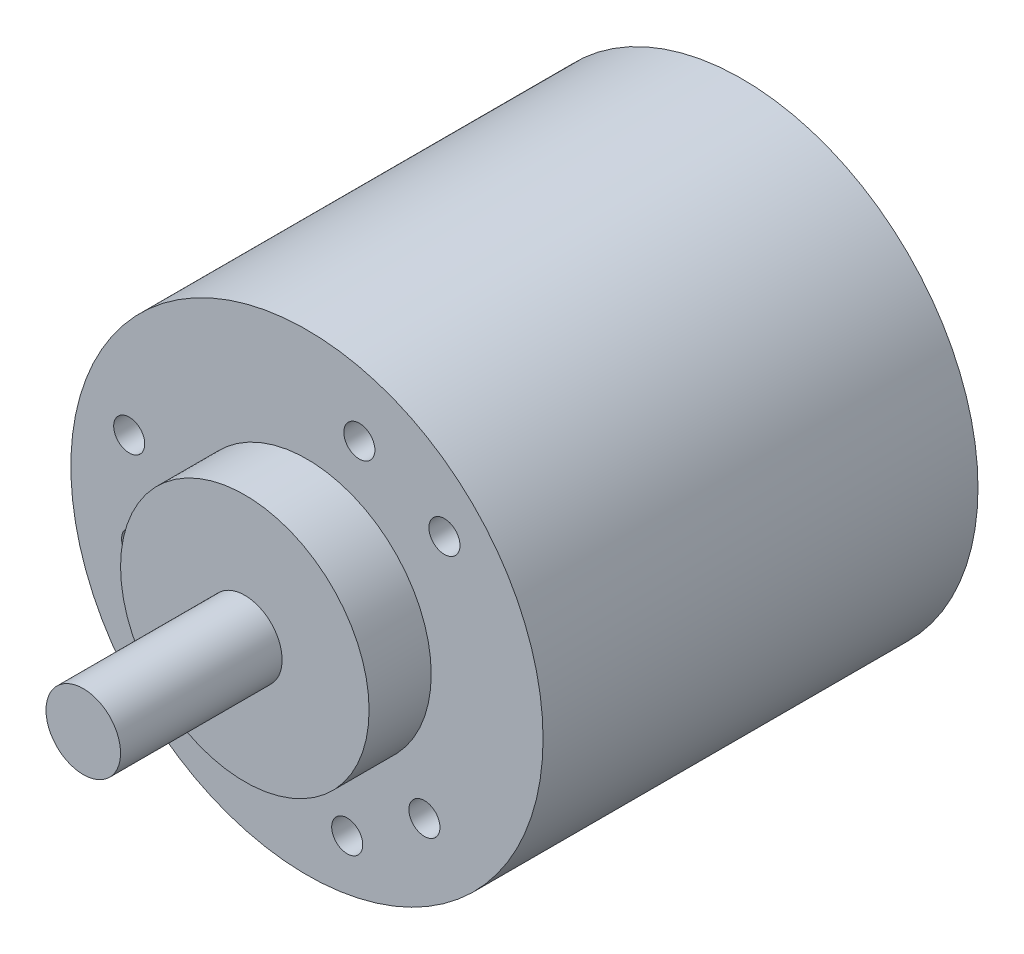
ISO-10303-21;
HEADER;
FILE_DESCRIPTION(('STEP AP214'),'2;1');
FILE_NAME('part.step','',(''),(''),'','','');
FILE_SCHEMA(('AUTOMOTIVE_DESIGN { 1 0 10303 214 1 1 1 1 }'));
ENDSEC;
DATA;
#1=APPLICATION_CONTEXT('core data for automotive mechanical design processes');
#2=APPLICATION_PROTOCOL_DEFINITION('international standard','automotive_design',2000,#1);
#3=PRODUCT_CONTEXT('',#1,'mechanical');
#4=PRODUCT('Part','Part','',(#3));
#5=PRODUCT_RELATED_PRODUCT_CATEGORY('part','',(#4));
#6=PRODUCT_DEFINITION_FORMATION('','',#4);
#7=PRODUCT_DEFINITION_CONTEXT('part definition',#1,'design');
#8=PRODUCT_DEFINITION('design','',#6,#7);
#9=PRODUCT_DEFINITION_SHAPE('','',#8);
#10=(LENGTH_UNIT() NAMED_UNIT(*) SI_UNIT(.MILLI.,.METRE.));
#11=(NAMED_UNIT(*) PLANE_ANGLE_UNIT() SI_UNIT($,.RADIAN.));
#12=(NAMED_UNIT(*) SI_UNIT($,.STERADIAN.) SOLID_ANGLE_UNIT());
#13=UNCERTAINTY_MEASURE_WITH_UNIT(LENGTH_MEASURE(1.E-05),#10,'distance_accuracy_value','');
#14=(GEOMETRIC_REPRESENTATION_CONTEXT(3) GLOBAL_UNCERTAINTY_ASSIGNED_CONTEXT((#13)) GLOBAL_UNIT_ASSIGNED_CONTEXT((#10,
#11,#12)) REPRESENTATION_CONTEXT('',''));
#15=CARTESIAN_POINT('',(0.,0.,0.));
#16=DIRECTION('',(0.,0.,1.));
#17=DIRECTION('',(1.,0.,0.));
#18=AXIS2_PLACEMENT_3D('',#15,#16,#17);
#19=CARTESIAN_POINT('',(0.,0.,35.));
#20=DIRECTION('',(0.,0.,-1.));
#21=DIRECTION('',(-1.,0.,0.));
#22=AXIS2_PLACEMENT_3D('',#19,#20,#21);
#23=CYLINDRICAL_SURFACE('',#22,19.);
#24=CARTESIAN_POINT('',(0.,0.,35.));
#25=DIRECTION('',(0.,0.,1.));
#26=DIRECTION('',(1.,0.,0.));
#27=AXIS2_PLACEMENT_3D('',#24,#25,#26);
#28=CIRCLE('',#27,19.);
#29=CARTESIAN_POINT('',(19.,0.,35.));
#30=VERTEX_POINT('',#29);
#31=EDGE_CURVE('E10',#30,#30,#28,.T.);
#32=ORIENTED_EDGE('',*,*,#31,.F.);
#33=EDGE_LOOP('',(#32));
#34=FACE_BOUND('',#33,.T.);
#35=CARTESIAN_POINT('',(0.,0.,0.));
#36=DIRECTION('',(0.,0.,1.));
#37=DIRECTION('',(1.,0.,0.));
#38=AXIS2_PLACEMENT_3D('',#35,#36,#37);
#39=CIRCLE('',#38,19.);
#40=CARTESIAN_POINT('',(19.,0.,0.));
#41=VERTEX_POINT('',#40);
#42=EDGE_CURVE('E34',#41,#41,#39,.T.);
#43=ORIENTED_EDGE('',*,*,#42,.T.);
#44=EDGE_LOOP('',(#43));
#45=FACE_BOUND('',#44,.T.);
#46=ADVANCED_FACE('F31',(#34,#45),#23,.T.);
#47=CARTESIAN_POINT('',(0.,0.,35.));
#48=DIRECTION('',(0.,0.,1.));
#49=DIRECTION('',(1.,0.,0.));
#50=AXIS2_PLACEMENT_3D('',#47,#48,#49);
#51=PLANE('',#50);
#52=CARTESIAN_POINT('',(4.21630395639813,13.3500105223652,35.));
#53=DIRECTION('',(0.,0.,1.));
#54=DIRECTION('',(1.,0.,0.));
#55=AXIS2_PLACEMENT_3D('',#52,#53,#54);
#56=CIRCLE('',#55,1.25);
#57=CARTESIAN_POINT('',(5.46630395639812,13.3500105223652,35.));
#58=VERTEX_POINT('',#57);
#59=EDGE_CURVE('E73',#58,#58,#56,.T.);
#60=ORIENTED_EDGE('',*,*,#59,.F.);
#61=EDGE_LOOP('',(#60));
#62=FACE_BOUND('',#61,.T.);
#63=CARTESIAN_POINT('',(11.0640338544645,10.1285317231701,35.));
#64=DIRECTION('',(0.,0.,1.));
#65=DIRECTION('',(1.,0.,0.));
#66=AXIS2_PLACEMENT_3D('',#63,#64,#65);
#67=CIRCLE('',#66,1.25);
#68=CARTESIAN_POINT('',(12.3140338544645,10.1285317231701,35.));
#69=VERTEX_POINT('',#68);
#70=EDGE_CURVE('E79',#69,#69,#67,.T.);
#71=ORIENTED_EDGE('',*,*,#70,.F.);
#72=EDGE_LOOP('',(#71));
#73=FACE_BOUND('',#72,.T.);
#74=CARTESIAN_POINT('',(9.45329627495879,-10.3264315975002,35.));
#75=DIRECTION('',(0.,0.,1.));
#76=DIRECTION('',(1.,0.,0.));
#77=AXIS2_PLACEMENT_3D('',#74,#75,#76);
#78=CIRCLE('',#77,1.25);
#79=CARTESIAN_POINT('',(10.7032962749588,-10.3264315975002,35.));
#80=VERTEX_POINT('',#79);
#81=EDGE_CURVE('E85',#80,#80,#78,.T.);
#82=ORIENTED_EDGE('',*,*,#81,.F.);
#83=EDGE_LOOP('',(#82));
#84=FACE_BOUND('',#83,.T.);
#85=CARTESIAN_POINT('',(3.23954884806965,-14.6460002478824,35.));
#86=DIRECTION('',(0.,0.,1.));
#87=DIRECTION('',(1.,0.,0.));
#88=AXIS2_PLACEMENT_3D('',#85,#86,#87);
#89=CIRCLE('',#88,1.25);
#90=CARTESIAN_POINT('',(4.48954884806965,-14.6460002478824,35.));
#91=VERTEX_POINT('',#90);
#92=EDGE_CURVE('E61',#91,#91,#89,.T.);
#93=ORIENTED_EDGE('',*,*,#92,.F.);
#94=EDGE_LOOP('',(#93));
#95=FACE_BOUND('',#94,.T.);
#96=CARTESIAN_POINT('',(-13.6696002313569,-3.02357892486496,35.));
#97=DIRECTION('',(0.,0.,1.));
#98=DIRECTION('',(1.,0.,0.));
#99=AXIS2_PLACEMENT_3D('',#96,#97,#98);
#100=CIRCLE('',#99,1.25);
#101=CARTESIAN_POINT('',(-12.4196002313569,-3.02357892486496,35.));
#102=VERTEX_POINT('',#101);
#103=EDGE_CURVE('E68',#102,#102,#100,.T.);
#104=ORIENTED_EDGE('',*,*,#103,.F.);
#105=EDGE_LOOP('',(#104));
#106=FACE_BOUND('',#105,.T.);
#107=CARTESIAN_POINT('',(-14.3035827025342,4.51746852471222,35.));
#108=DIRECTION('',(0.,0.,1.));
#109=DIRECTION('',(1.,0.,0.));
#110=AXIS2_PLACEMENT_3D('',#107,#108,#109);
#111=CIRCLE('',#110,1.25);
#112=CARTESIAN_POINT('',(-13.0535827025342,4.51746852471222,35.));
#113=VERTEX_POINT('',#112);
#114=EDGE_CURVE('E55',#113,#113,#111,.T.);
#115=ORIENTED_EDGE('',*,*,#114,.F.);
#116=EDGE_LOOP('',(#115));
#117=FACE_BOUND('',#116,.T.);
#118=CARTESIAN_POINT('',(0.,0.,35.));
#119=DIRECTION('',(0.,0.,1.));
#120=DIRECTION('',(1.,0.,0.));
#121=AXIS2_PLACEMENT_3D('',#118,#119,#120);
#122=CIRCLE('',#121,10.);
#123=CARTESIAN_POINT('',(10.,0.,35.));
#124=VERTEX_POINT('',#123);
#125=EDGE_CURVE('E43',#124,#124,#122,.T.);
#126=ORIENTED_EDGE('',*,*,#125,.F.);
#127=EDGE_LOOP('',(#126));
#128=FACE_BOUND('',#127,.T.);
#129=ORIENTED_EDGE('',*,*,#31,.T.);
#130=EDGE_LOOP('',(#129));
#131=FACE_BOUND('',#130,.T.);
#132=ADVANCED_FACE('F100',(#62,#73,#84,#95,#106,#117,#128,#131),#51,.T.);
#133=CARTESIAN_POINT('',(0.,0.,0.));
#134=DIRECTION('',(0.,0.,1.));
#135=DIRECTION('',(1.,0.,0.));
#136=AXIS2_PLACEMENT_3D('',#133,#134,#135);
#137=PLANE('',#136);
#138=ORIENTED_EDGE('',*,*,#42,.F.);
#139=EDGE_LOOP('',(#138));
#140=FACE_BOUND('',#139,.T.);
#141=ADVANCED_FACE('F103',(#140),#137,.F.);
#142=CARTESIAN_POINT('',(0.,0.,40.));
#143=DIRECTION('',(0.,0.,-1.));
#144=DIRECTION('',(-1.,0.,0.));
#145=AXIS2_PLACEMENT_3D('',#142,#143,#144);
#146=CYLINDRICAL_SURFACE('',#145,10.);
#147=CARTESIAN_POINT('',(0.,0.,40.));
#148=DIRECTION('',(0.,0.,1.));
#149=DIRECTION('',(1.,0.,0.));
#150=AXIS2_PLACEMENT_3D('',#147,#148,#149);
#151=CIRCLE('',#150,10.);
#152=CARTESIAN_POINT('',(10.,0.,40.));
#153=VERTEX_POINT('',#152);
#154=EDGE_CURVE('E41',#153,#153,#151,.T.);
#155=ORIENTED_EDGE('',*,*,#154,.F.);
#156=EDGE_LOOP('',(#155));
#157=FACE_BOUND('',#156,.T.);
#158=ORIENTED_EDGE('',*,*,#125,.T.);
#159=EDGE_LOOP('',(#158));
#160=FACE_BOUND('',#159,.T.);
#161=ADVANCED_FACE('F114',(#157,#160),#146,.T.);
#162=CARTESIAN_POINT('',(0.,0.,40.));
#163=DIRECTION('',(0.,0.,1.));
#164=DIRECTION('',(1.,0.,0.));
#165=AXIS2_PLACEMENT_3D('',#162,#163,#164);
#166=PLANE('',#165);
#167=CARTESIAN_POINT('',(0.,0.,40.));
#168=DIRECTION('',(0.,0.,1.));
#169=DIRECTION('',(1.,0.,0.));
#170=AXIS2_PLACEMENT_3D('',#167,#168,#169);
#171=CIRCLE('',#170,3.);
#172=CARTESIAN_POINT('',(-3.,0.,40.));
#173=VERTEX_POINT('',#172);
#174=EDGE_CURVE('E49',#173,#173,#171,.T.);
#175=ORIENTED_EDGE('',*,*,#174,.F.);
#176=EDGE_LOOP('',(#175));
#177=FACE_BOUND('',#176,.T.);
#178=ORIENTED_EDGE('',*,*,#154,.T.);
#179=EDGE_LOOP('',(#178));
#180=FACE_BOUND('',#179,.T.);
#181=ADVANCED_FACE('F116',(#177,#180),#166,.T.);
#182=CARTESIAN_POINT('',(0.,0.,53.));
#183=DIRECTION('',(0.,0.,-1.));
#184=DIRECTION('',(-1.,0.,0.));
#185=AXIS2_PLACEMENT_3D('',#182,#183,#184);
#186=CYLINDRICAL_SURFACE('',#185,3.);
#187=CARTESIAN_POINT('',(0.,0.,53.));
#188=DIRECTION('',(0.,0.,1.));
#189=DIRECTION('',(1.,0.,0.));
#190=AXIS2_PLACEMENT_3D('',#187,#188,#189);
#191=CIRCLE('',#190,3.);
#192=CARTESIAN_POINT('',(-3.,0.,53.));
#193=VERTEX_POINT('',#192);
#194=EDGE_CURVE('E46',#193,#193,#191,.T.);
#195=CARTESIAN_POINT('',(-3.,0.,53.));
#196=CARTESIAN_POINT('',(-3.,0.,52.8645833333333));
#197=CARTESIAN_POINT('',(-3.,0.,52.7291666666667));
#198=CARTESIAN_POINT('',(-3.,0.,52.4583333333333));
#199=CARTESIAN_POINT('',(-3.,0.,52.3229166666667));
#200=CARTESIAN_POINT('',(-3.,0.,52.0520833333333));
#201=CARTESIAN_POINT('',(-3.,0.,51.9166666666667));
#202=CARTESIAN_POINT('',(-3.,0.,51.6458333333333));
#203=CARTESIAN_POINT('',(-3.,0.,51.5104166666667));
#204=CARTESIAN_POINT('',(-3.,0.,51.2395833333333));
#205=CARTESIAN_POINT('',(-3.,0.,51.1041666666667));
#206=CARTESIAN_POINT('',(-3.,0.,50.8333333333333));
#207=CARTESIAN_POINT('',(-3.,0.,50.6979166666667));
#208=CARTESIAN_POINT('',(-3.,0.,50.4270833333333));
#209=CARTESIAN_POINT('',(-3.,0.,50.2916666666667));
#210=CARTESIAN_POINT('',(-3.,0.,50.0208333333333));
#211=CARTESIAN_POINT('',(-3.,0.,49.8854166666667));
#212=CARTESIAN_POINT('',(-3.,0.,49.6145833333333));
#213=CARTESIAN_POINT('',(-3.,0.,49.4791666666667));
#214=CARTESIAN_POINT('',(-3.,0.,49.2083333333333));
#215=CARTESIAN_POINT('',(-3.,0.,49.0729166666667));
#216=CARTESIAN_POINT('',(-3.,0.,48.8020833333333));
#217=CARTESIAN_POINT('',(-3.,0.,48.6666666666667));
#218=CARTESIAN_POINT('',(-3.,0.,48.3958333333333));
#219=CARTESIAN_POINT('',(-3.,0.,48.2604166666667));
#220=CARTESIAN_POINT('',(-3.,0.,47.9895833333333));
#221=CARTESIAN_POINT('',(-3.,0.,47.8541666666667));
#222=CARTESIAN_POINT('',(-3.,0.,47.5833333333333));
#223=CARTESIAN_POINT('',(-3.,0.,47.4479166666667));
#224=CARTESIAN_POINT('',(-3.,0.,47.1770833333333));
#225=CARTESIAN_POINT('',(-3.,0.,47.0416666666667));
#226=CARTESIAN_POINT('',(-3.,0.,46.7708333333333));
#227=CARTESIAN_POINT('',(-3.,0.,46.6354166666667));
#228=CARTESIAN_POINT('',(-3.,0.,46.3645833333333));
#229=CARTESIAN_POINT('',(-3.,0.,46.2291666666667));
#230=CARTESIAN_POINT('',(-3.,0.,45.9583333333333));
#231=CARTESIAN_POINT('',(-3.,0.,45.8229166666667));
#232=CARTESIAN_POINT('',(-3.,0.,45.5520833333333));
#233=CARTESIAN_POINT('',(-3.,0.,45.4166666666667));
#234=CARTESIAN_POINT('',(-3.,0.,45.1458333333333));
#235=CARTESIAN_POINT('',(-3.,0.,45.0104166666667));
#236=CARTESIAN_POINT('',(-3.,0.,44.7395833333333));
#237=CARTESIAN_POINT('',(-3.,0.,44.6041666666667));
#238=CARTESIAN_POINT('',(-3.,0.,44.3333333333333));
#239=CARTESIAN_POINT('',(-3.,0.,44.1979166666667));
#240=CARTESIAN_POINT('',(-3.,0.,43.9270833333333));
#241=CARTESIAN_POINT('',(-3.,0.,43.7916666666667));
#242=CARTESIAN_POINT('',(-3.,0.,43.5208333333333));
#243=CARTESIAN_POINT('',(-3.,0.,43.3854166666667));
#244=CARTESIAN_POINT('',(-3.,0.,43.1145833333333));
#245=CARTESIAN_POINT('',(-3.,0.,42.9791666666667));
#246=CARTESIAN_POINT('',(-3.,0.,42.7083333333333));
#247=CARTESIAN_POINT('',(-3.,0.,42.5729166666667));
#248=CARTESIAN_POINT('',(-3.,0.,42.3020833333333));
#249=CARTESIAN_POINT('',(-3.,0.,42.1666666666667));
#250=CARTESIAN_POINT('',(-3.,0.,41.8958333333333));
#251=CARTESIAN_POINT('',(-3.,0.,41.7604166666667));
#252=CARTESIAN_POINT('',(-3.,0.,41.4895833333333));
#253=CARTESIAN_POINT('',(-3.,0.,41.3541666666667));
#254=CARTESIAN_POINT('',(-3.,0.,41.0833333333333));
#255=CARTESIAN_POINT('',(-3.,0.,40.9479166666667));
#256=CARTESIAN_POINT('',(-3.,0.,40.6770833333333));
#257=CARTESIAN_POINT('',(-3.,0.,40.5416666666667));
#258=CARTESIAN_POINT('',(-3.,0.,40.2708333333333));
#259=CARTESIAN_POINT('',(-3.,0.,40.1354166666667));
#260=CARTESIAN_POINT('',(-3.,0.,40.));
#261=B_SPLINE_CURVE_WITH_KNOTS('',3,(#195,#196,#197,#198,#199,#200,#201,#202,#203,#204,#205,
#206,#207,#208,#209,#210,#211,#212,#213,#214,#215,#216,#217,#218,#219,#220,#221,#222,#223,#224,
#225,#226,#227,#228,#229,#230,#231,#232,#233,#234,#235,#236,#237,#238,#239,#240,#241,#242,#243,
#244,#245,#246,#247,#248,#249,#250,#251,#252,#253,#254,#255,#256,#257,#258,#259,#260),
.UNSPECIFIED.,.F.,.F.,(4,2,2,2,2,2,2,2,2,2,2,2,2,2,2,2,2,2,2,2,2,2,2,2,2,2,2,2,2,2,2,2,4),(0.,
0.406250000000004,0.812500000000001,1.21875,1.625,2.03125000000001,2.4375,2.84375,3.25,3.65625,
4.0625,4.46875,4.875,5.28125,5.68750000000001,6.09375,6.5,6.90625,7.3125,7.71875,8.125,8.53125,
8.9375,9.34375,9.75,10.15625,10.5625,10.96875,11.375,11.78125,12.1875,12.59375,13.),.UNSPECIFIED.);
#262=EDGE_CURVE('BSEAM123',#193,#173,#261,.T.);
#263=ORIENTED_EDGE('',*,*,#194,.F.);
#264=ORIENTED_EDGE('',*,*,#174,.T.);
#265=ORIENTED_EDGE('',*,*,#262,.T.);
#266=ORIENTED_EDGE('',*,*,#262,.F.);
#267=EDGE_LOOP('',(#263,#265,#264,#266));
#268=FACE_BOUND('',#267,.T.);
#269=ADVANCED_FACE('F123',(#268),#186,.T.);
#270=CARTESIAN_POINT('',(0.,0.,53.));
#271=DIRECTION('',(0.,0.,1.));
#272=DIRECTION('',(1.,0.,0.));
#273=AXIS2_PLACEMENT_3D('',#270,#271,#272);
#274=PLANE('',#273);
#275=ORIENTED_EDGE('',*,*,#194,.T.);
#276=EDGE_LOOP('',(#275));
#277=FACE_BOUND('',#276,.T.);
#278=ADVANCED_FACE('F162',(#277),#274,.T.);
#279=CARTESIAN_POINT('',(-14.3035827025342,4.51746852471222,27.));
#280=DIRECTION('',(0.,0.,1.));
#281=DIRECTION('',(1.,0.,0.));
#282=AXIS2_PLACEMENT_3D('',#279,#280,#281);
#283=CYLINDRICAL_SURFACE('',#282,1.25);
#284=CARTESIAN_POINT('',(-14.3035827025342,4.51746852471222,27.));
#285=DIRECTION('',(0.,0.,1.));
#286=DIRECTION('',(1.,0.,0.));
#287=AXIS2_PLACEMENT_3D('',#284,#285,#286);
#288=CIRCLE('',#287,1.25);
#289=CARTESIAN_POINT('',(-13.0535827025342,4.51746852471222,27.));
#290=VERTEX_POINT('',#289);
#291=EDGE_CURVE('E52',#290,#290,#288,.T.);
#292=ORIENTED_EDGE('',*,*,#291,.F.);
#293=EDGE_LOOP('',(#292));
#294=FACE_BOUND('',#293,.T.);
#295=ORIENTED_EDGE('',*,*,#114,.T.);
#296=EDGE_LOOP('',(#295));
#297=FACE_BOUND('',#296,.T.);
#298=ADVANCED_FACE('F171',(#294,#297),#283,.F.);
#299=CARTESIAN_POINT('',(0.,0.,27.));
#300=DIRECTION('',(0.,0.,1.));
#301=DIRECTION('',(1.,0.,0.));
#302=AXIS2_PLACEMENT_3D('',#299,#300,#301);
#303=PLANE('',#302);
#304=ORIENTED_EDGE('',*,*,#291,.T.);
#305=EDGE_LOOP('',(#304));
#306=FACE_BOUND('',#305,.T.);
#307=ADVANCED_FACE('F181',(#306),#303,.T.);
#308=CARTESIAN_POINT('',(-13.6696002313569,-3.02357892486496,27.));
#309=DIRECTION('',(0.,0.,1.));
#310=DIRECTION('',(1.,0.,0.));
#311=AXIS2_PLACEMENT_3D('',#308,#309,#310);
#312=CYLINDRICAL_SURFACE('',#311,1.25);
#313=CARTESIAN_POINT('',(-13.6696002313569,-3.02357892486496,27.));
#314=DIRECTION('',(0.,0.,1.));
#315=DIRECTION('',(1.,0.,0.));
#316=AXIS2_PLACEMENT_3D('',#313,#314,#315);
#317=CIRCLE('',#316,1.25);
#318=CARTESIAN_POINT('',(-12.4196002313569,-3.02357892486496,27.));
#319=VERTEX_POINT('',#318);
#320=EDGE_CURVE('E58',#319,#319,#317,.T.);
#321=ORIENTED_EDGE('',*,*,#320,.F.);
#322=EDGE_LOOP('',(#321));
#323=FACE_BOUND('',#322,.T.);
#324=ORIENTED_EDGE('',*,*,#103,.T.);
#325=EDGE_LOOP('',(#324));
#326=FACE_BOUND('',#325,.T.);
#327=ADVANCED_FACE('F188',(#323,#326),#312,.F.);
#328=CARTESIAN_POINT('',(0.,0.,27.));
#329=DIRECTION('',(0.,0.,1.));
#330=DIRECTION('',(1.,0.,0.));
#331=AXIS2_PLACEMENT_3D('',#328,#329,#330);
#332=PLANE('',#331);
#333=ORIENTED_EDGE('',*,*,#320,.T.);
#334=EDGE_LOOP('',(#333));
#335=FACE_BOUND('',#334,.T.);
#336=ADVANCED_FACE('F196',(#335),#332,.T.);
#337=CARTESIAN_POINT('',(3.23954884806965,-14.6460002478824,27.));
#338=DIRECTION('',(0.,0.,1.));
#339=DIRECTION('',(1.,0.,0.));
#340=AXIS2_PLACEMENT_3D('',#337,#338,#339);
#341=CYLINDRICAL_SURFACE('',#340,1.25);
#342=CARTESIAN_POINT('',(3.23954884806965,-14.6460002478824,27.));
#343=DIRECTION('',(0.,0.,1.));
#344=DIRECTION('',(1.,0.,0.));
#345=AXIS2_PLACEMENT_3D('',#342,#343,#344);
#346=CIRCLE('',#345,1.25);
#347=CARTESIAN_POINT('',(4.48954884806965,-14.6460002478824,27.));
#348=VERTEX_POINT('',#347);
#349=EDGE_CURVE('E64',#348,#348,#346,.T.);
#350=ORIENTED_EDGE('',*,*,#349,.F.);
#351=EDGE_LOOP('',(#350));
#352=FACE_BOUND('',#351,.T.);
#353=ORIENTED_EDGE('',*,*,#92,.T.);
#354=EDGE_LOOP('',(#353));
#355=FACE_BOUND('',#354,.T.);
#356=ADVANCED_FACE('F204',(#352,#355),#341,.F.);
#357=CARTESIAN_POINT('',(0.,0.,27.));
#358=DIRECTION('',(0.,0.,1.));
#359=DIRECTION('',(1.,0.,0.));
#360=AXIS2_PLACEMENT_3D('',#357,#358,#359);
#361=PLANE('',#360);
#362=ORIENTED_EDGE('',*,*,#349,.T.);
#363=EDGE_LOOP('',(#362));
#364=FACE_BOUND('',#363,.T.);
#365=ADVANCED_FACE('F96',(#364),#361,.T.);
#366=CARTESIAN_POINT('',(9.45329627495879,-10.3264315975002,27.));
#367=DIRECTION('',(0.,0.,1.));
#368=DIRECTION('',(1.,0.,0.));
#369=AXIS2_PLACEMENT_3D('',#366,#367,#368);
#370=CYLINDRICAL_SURFACE('',#369,1.25);
#371=CARTESIAN_POINT('',(9.45329627495879,-10.3264315975002,27.));
#372=DIRECTION('',(0.,0.,1.));
#373=DIRECTION('',(1.,0.,0.));
#374=AXIS2_PLACEMENT_3D('',#371,#372,#373);
#375=CIRCLE('',#374,1.25);
#376=CARTESIAN_POINT('',(10.7032962749588,-10.3264315975002,27.));
#377=VERTEX_POINT('',#376);
#378=EDGE_CURVE('E65',#377,#377,#375,.T.);
#379=ORIENTED_EDGE('',*,*,#378,.F.);
#380=EDGE_LOOP('',(#379));
#381=FACE_BOUND('',#380,.T.);
#382=ORIENTED_EDGE('',*,*,#81,.T.);
#383=EDGE_LOOP('',(#382));
#384=FACE_BOUND('',#383,.T.);
#385=ADVANCED_FACE('F93',(#381,#384),#370,.F.);
#386=CARTESIAN_POINT('',(0.,0.,27.));
#387=DIRECTION('',(0.,0.,1.));
#388=DIRECTION('',(1.,0.,0.));
#389=AXIS2_PLACEMENT_3D('',#386,#387,#388);
#390=PLANE('',#389);
#391=ORIENTED_EDGE('',*,*,#378,.T.);
#392=EDGE_LOOP('',(#391));
#393=FACE_BOUND('',#392,.T.);
#394=ADVANCED_FACE('F91',(#393),#390,.T.);
#395=CARTESIAN_POINT('',(11.0640338544645,10.1285317231701,27.));
#396=DIRECTION('',(0.,0.,1.));
#397=DIRECTION('',(1.,0.,0.));
#398=AXIS2_PLACEMENT_3D('',#395,#396,#397);
#399=CYLINDRICAL_SURFACE('',#398,1.25);
#400=CARTESIAN_POINT('',(11.0640338544645,10.1285317231701,27.));
#401=DIRECTION('',(0.,0.,1.));
#402=DIRECTION('',(1.,0.,0.));
#403=AXIS2_PLACEMENT_3D('',#400,#401,#402);
#404=CIRCLE('',#403,1.25);
#405=CARTESIAN_POINT('',(12.3140338544645,10.1285317231701,27.));
#406=VERTEX_POINT('',#405);
#407=EDGE_CURVE('E82',#406,#406,#404,.T.);
#408=ORIENTED_EDGE('',*,*,#407,.F.);
#409=EDGE_LOOP('',(#408));
#410=FACE_BOUND('',#409,.T.);
#411=ORIENTED_EDGE('',*,*,#70,.T.);
#412=EDGE_LOOP('',(#411));
#413=FACE_BOUND('',#412,.T.);
#414=ADVANCED_FACE('F230',(#410,#413),#399,.F.);
#415=CARTESIAN_POINT('',(0.,0.,27.));
#416=DIRECTION('',(0.,0.,1.));
#417=DIRECTION('',(1.,0.,0.));
#418=AXIS2_PLACEMENT_3D('',#415,#416,#417);
#419=PLANE('',#418);
#420=ORIENTED_EDGE('',*,*,#407,.T.);
#421=EDGE_LOOP('',(#420));
#422=FACE_BOUND('',#421,.T.);
#423=ADVANCED_FACE('F237',(#422),#419,.T.);
#424=CARTESIAN_POINT('',(4.21630395639813,13.3500105223652,27.));
#425=DIRECTION('',(0.,0.,1.));
#426=DIRECTION('',(1.,0.,0.));
#427=AXIS2_PLACEMENT_3D('',#424,#425,#426);
#428=CYLINDRICAL_SURFACE('',#427,1.25);
#429=CARTESIAN_POINT('',(4.21630395639813,13.3500105223652,27.));
#430=DIRECTION('',(0.,0.,1.));
#431=DIRECTION('',(1.,0.,0.));
#432=AXIS2_PLACEMENT_3D('',#429,#430,#431);
#433=CIRCLE('',#432,1.25);
#434=CARTESIAN_POINT('',(5.46630395639812,13.3500105223652,27.));
#435=VERTEX_POINT('',#434);
#436=EDGE_CURVE('E76',#435,#435,#433,.T.);
#437=ORIENTED_EDGE('',*,*,#436,.F.);
#438=EDGE_LOOP('',(#437));
#439=FACE_BOUND('',#438,.T.);
#440=ORIENTED_EDGE('',*,*,#59,.T.);
#441=EDGE_LOOP('',(#440));
#442=FACE_BOUND('',#441,.T.);
#443=ADVANCED_FACE('F245',(#439,#442),#428,.F.);
#444=CARTESIAN_POINT('',(0.,0.,27.));
#445=DIRECTION('',(0.,0.,1.));
#446=DIRECTION('',(1.,0.,0.));
#447=AXIS2_PLACEMENT_3D('',#444,#445,#446);
#448=PLANE('',#447);
#449=ORIENTED_EDGE('',*,*,#436,.T.);
#450=EDGE_LOOP('',(#449));
#451=FACE_BOUND('',#450,.T.);
#452=ADVANCED_FACE('F253',(#451),#448,.T.);
#453=CLOSED_SHELL('',(#46,#132,#141,#161,#181,#269,#278,#298,#307,#327,#336,#356,#365,#385,#394,
#414,#423,#443,#452));
#454=MANIFOLD_SOLID_BREP('B2',#453);
#455=ADVANCED_BREP_SHAPE_REPRESENTATION('',(#18,#454),#14);
#456=SHAPE_DEFINITION_REPRESENTATION(#9,#455);
ENDSEC;
END-ISO-10303-21;
